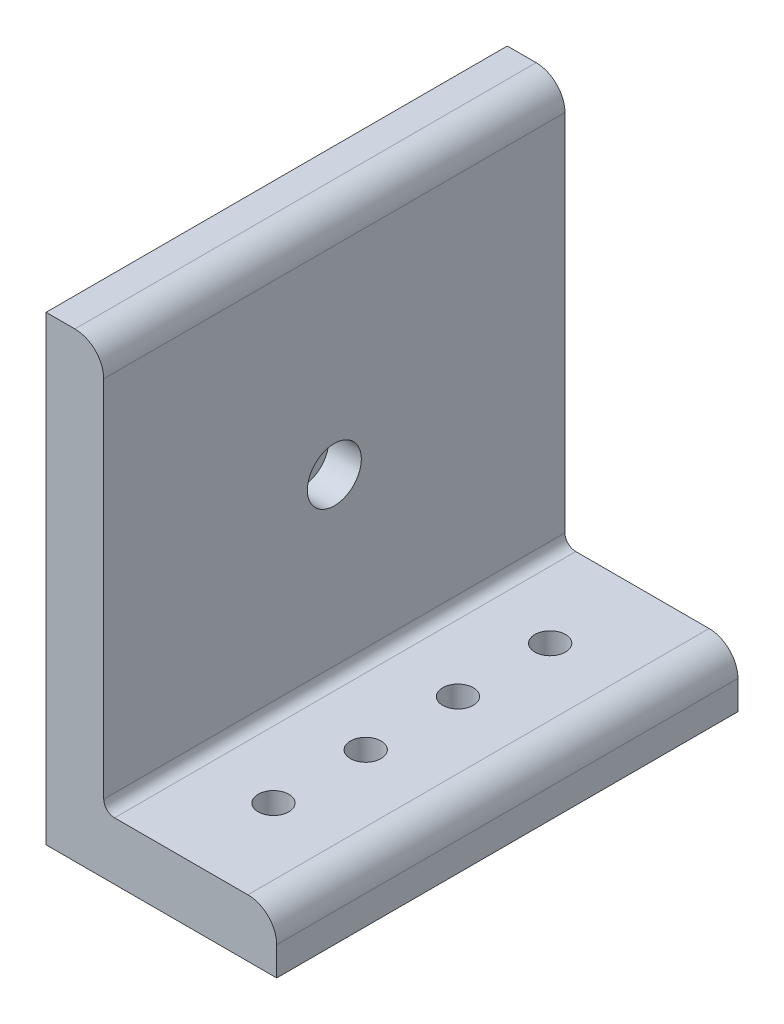
ISO-10303-21;
HEADER;
FILE_DESCRIPTION(('STEP AP214'),'2;1');
FILE_NAME('part.step','',(''),(''),'','','');
FILE_SCHEMA(('AUTOMOTIVE_DESIGN { 1 0 10303 214 1 1 1 1 }'));
ENDSEC;
DATA;
#1=APPLICATION_CONTEXT('core data for automotive mechanical design processes');
#2=APPLICATION_PROTOCOL_DEFINITION('international standard','automotive_design',2000,#1);
#3=PRODUCT_CONTEXT('',#1,'mechanical');
#4=PRODUCT('Part','Part','',(#3));
#5=PRODUCT_RELATED_PRODUCT_CATEGORY('part','',(#4));
#6=PRODUCT_DEFINITION_FORMATION('','',#4);
#7=PRODUCT_DEFINITION_CONTEXT('part definition',#1,'design');
#8=PRODUCT_DEFINITION('design','',#6,#7);
#9=PRODUCT_DEFINITION_SHAPE('','',#8);
#10=(LENGTH_UNIT() NAMED_UNIT(*) SI_UNIT(.MILLI.,.METRE.));
#11=(NAMED_UNIT(*) PLANE_ANGLE_UNIT() SI_UNIT($,.RADIAN.));
#12=(NAMED_UNIT(*) SI_UNIT($,.STERADIAN.) SOLID_ANGLE_UNIT());
#13=UNCERTAINTY_MEASURE_WITH_UNIT(LENGTH_MEASURE(1.E-05),#10,'distance_accuracy_value','');
#14=(GEOMETRIC_REPRESENTATION_CONTEXT(3) GLOBAL_UNCERTAINTY_ASSIGNED_CONTEXT((#13)) GLOBAL_UNIT_ASSIGNED_CONTEXT((#10,
#11,#12)) REPRESENTATION_CONTEXT('',''));
#15=CARTESIAN_POINT('',(0.,0.,0.));
#16=DIRECTION('',(0.,0.,1.));
#17=DIRECTION('',(1.,0.,0.));
#18=AXIS2_PLACEMENT_3D('',#15,#16,#17);
#19=CARTESIAN_POINT('',(421.099925431454,-195.774980879017,69.5361036958903));
#20=DIRECTION('',(0.,-1.,0.));
#21=DIRECTION('',(0.,0.,-1.));
#22=AXIS2_PLACEMENT_3D('',#19,#20,#21);
#23=PLANE('',#22);
#24=CARTESIAN_POINT('',(450.471215431454,-195.774980879017,-93.0238963041097));
#25=DIRECTION('',(0.,1.,0.));
#26=DIRECTION('',(0.,0.,1.));
#27=AXIS2_PLACEMENT_3D('',#24,#25,#26);
#28=CIRCLE('',#27,6.74624000000001);
#29=CARTESIAN_POINT('',(450.471215431454,-195.774980879017,-86.2776563041097));
#30=VERTEX_POINT('',#29);
#31=EDGE_CURVE('E256',#30,#30,#28,.T.);
#32=ORIENTED_EDGE('',*,*,#31,.F.);
#33=EDGE_LOOP('',(#32));
#34=FACE_BOUND('',#33,.T.);
#35=CARTESIAN_POINT('',(450.471215431454,-195.774980879017,-52.3838963041097));
#36=DIRECTION('',(0.,1.,0.));
#37=DIRECTION('',(0.,0.,1.));
#38=AXIS2_PLACEMENT_3D('',#35,#36,#37);
#39=CIRCLE('',#38,6.74624000000001);
#40=CARTESIAN_POINT('',(450.471215431454,-195.774980879017,-45.6376563041097));
#41=VERTEX_POINT('',#40);
#42=EDGE_CURVE('E250',#41,#41,#39,.T.);
#43=ORIENTED_EDGE('',*,*,#42,.F.);
#44=EDGE_LOOP('',(#43));
#45=FACE_BOUND('',#44,.T.);
#46=CARTESIAN_POINT('',(450.471215431454,-195.774980879017,-11.7438963041097));
#47=DIRECTION('',(0.,1.,0.));
#48=DIRECTION('',(0.,0.,1.));
#49=AXIS2_PLACEMENT_3D('',#46,#47,#48);
#50=CIRCLE('',#49,6.74624000000001);
#51=CARTESIAN_POINT('',(450.471215431454,-195.774980879017,-4.9976563041097));
#52=VERTEX_POINT('',#51);
#53=EDGE_CURVE('E244',#52,#52,#50,.T.);
#54=ORIENTED_EDGE('',*,*,#53,.F.);
#55=EDGE_LOOP('',(#54));
#56=FACE_BOUND('',#55,.T.);
#57=DIRECTION('',(-1.,0.,0.));
#58=VECTOR('',#57,1.);
#59=CARTESIAN_POINT('',(421.099925431454,-195.774980879017,-133.66389630411));
#60=LINE('',#59,#58);
#61=CARTESIAN_POINT('',(479.842505431454,-195.774980879017,-133.66389630411));
#62=VERTEX_POINT('',#61);
#63=CARTESIAN_POINT('',(421.099925431454,-195.774980879017,-133.66389630411));
#64=VERTEX_POINT('',#63);
#65=EDGE_CURVE('E186',#62,#64,#60,.T.);
#66=ORIENTED_EDGE('',*,*,#65,.T.);
#67=DIRECTION('',(0.,0.,-1.));
#68=VECTOR('',#67,1.);
#69=CARTESIAN_POINT('',(421.099925431454,-195.774980879017,69.5361036958903));
#70=LINE('',#69,#68);
#71=CARTESIAN_POINT('',(421.099925431454,-195.774980879017,69.5361036958903));
#72=VERTEX_POINT('',#71);
#73=EDGE_CURVE('E202',#72,#64,#70,.T.);
#74=ORIENTED_EDGE('',*,*,#73,.F.);
#75=DIRECTION('',(-1.,0.,0.));
#76=VECTOR('',#75,1.);
#77=CARTESIAN_POINT('',(421.099925431454,-195.774980879017,69.5361036958903));
#78=LINE('',#77,#76);
#79=CARTESIAN_POINT('',(479.842505431454,-195.774980879017,69.5361036958903));
#80=VERTEX_POINT('',#79);
#81=EDGE_CURVE('E229',#80,#72,#78,.T.);
#82=ORIENTED_EDGE('',*,*,#81,.F.);
#83=DIRECTION('',(0.,0.,-1.));
#84=VECTOR('',#83,1.);
#85=CARTESIAN_POINT('',(479.842505431454,-195.774980879017,69.5361036958903));
#86=LINE('',#85,#84);
#87=EDGE_CURVE('E205',#80,#62,#86,.T.);
#88=ORIENTED_EDGE('',*,*,#87,.T.);
#89=EDGE_LOOP('',(#66,#74,#82,#88));
#90=FACE_BOUND('',#89,.T.);
#91=CARTESIAN_POINT('',(450.471215431454,-195.774980879017,28.8961036958903));
#92=DIRECTION('',(0.,1.,0.));
#93=DIRECTION('',(0.,0.,1.));
#94=AXIS2_PLACEMENT_3D('',#91,#92,#93);
#95=CIRCLE('',#94,6.74624000000001);
#96=CARTESIAN_POINT('',(450.471215431454,-195.774980879017,35.6423436958903));
#97=VERTEX_POINT('',#96);
#98=EDGE_CURVE('E238',#97,#97,#95,.T.);
#99=ORIENTED_EDGE('',*,*,#98,.F.);
#100=EDGE_LOOP('',(#99));
#101=FACE_BOUND('',#100,.T.);
#102=ADVANCED_FACE('F75',(#34,#45,#56,#90,#101),#23,.F.);
#103=CARTESIAN_POINT('',(492.537425431454,-221.174980879017,69.5361036958903));
#104=DIRECTION('',(0.,1.,0.));
#105=DIRECTION('',(0.,0.,1.));
#106=AXIS2_PLACEMENT_3D('',#103,#104,#105);
#107=PLANE('',#106);
#108=CARTESIAN_POINT('',(450.471215431454,-221.174980879017,-93.0238963041097));
#109=DIRECTION('',(0.,1.,0.));
#110=DIRECTION('',(0.,0.,1.));
#111=AXIS2_PLACEMENT_3D('',#108,#109,#110);
#112=CIRCLE('',#111,6.74624000000001);
#113=CARTESIAN_POINT('',(450.471215431454,-221.174980879017,-86.2776563041097));
#114=VERTEX_POINT('',#113);
#115=EDGE_CURVE('E253',#114,#114,#112,.T.);
#116=ORIENTED_EDGE('',*,*,#115,.T.);
#117=EDGE_LOOP('',(#116));
#118=FACE_BOUND('',#117,.T.);
#119=CARTESIAN_POINT('',(450.471215431454,-221.174980879017,-52.3838963041097));
#120=DIRECTION('',(0.,1.,0.));
#121=DIRECTION('',(0.,0.,1.));
#122=AXIS2_PLACEMENT_3D('',#119,#120,#121);
#123=CIRCLE('',#122,6.74624000000001);
#124=CARTESIAN_POINT('',(450.471215431454,-221.174980879017,-45.6376563041097));
#125=VERTEX_POINT('',#124);
#126=EDGE_CURVE('E247',#125,#125,#123,.T.);
#127=ORIENTED_EDGE('',*,*,#126,.T.);
#128=EDGE_LOOP('',(#127));
#129=FACE_BOUND('',#128,.T.);
#130=CARTESIAN_POINT('',(450.471215431454,-221.174980879017,-11.7438963041097));
#131=DIRECTION('',(0.,1.,0.));
#132=DIRECTION('',(0.,0.,1.));
#133=AXIS2_PLACEMENT_3D('',#130,#131,#132);
#134=CIRCLE('',#133,6.74624000000001);
#135=CARTESIAN_POINT('',(450.471215431454,-221.174980879017,-4.9976563041097));
#136=VERTEX_POINT('',#135);
#137=EDGE_CURVE('E241',#136,#136,#134,.T.);
#138=ORIENTED_EDGE('',*,*,#137,.T.);
#139=EDGE_LOOP('',(#138));
#140=FACE_BOUND('',#139,.T.);
#141=CARTESIAN_POINT('',(450.471215431454,-221.174980879017,28.8961036958903));
#142=DIRECTION('',(0.,1.,0.));
#143=DIRECTION('',(0.,0.,1.));
#144=AXIS2_PLACEMENT_3D('',#141,#142,#143);
#145=CIRCLE('',#144,6.74624000000001);
#146=CARTESIAN_POINT('',(450.471215431454,-221.174980879017,35.6423436958903));
#147=VERTEX_POINT('',#146);
#148=EDGE_CURVE('E182',#147,#147,#145,.T.);
#149=ORIENTED_EDGE('',*,*,#148,.T.);
#150=EDGE_LOOP('',(#149));
#151=FACE_BOUND('',#150,.T.);
#152=DIRECTION('',(1.,0.,0.));
#153=VECTOR('',#152,1.);
#154=CARTESIAN_POINT('',(492.537425431454,-221.174980879017,-133.66389630411));
#155=LINE('',#154,#153);
#156=CARTESIAN_POINT('',(390.937425431454,-221.174980879017,-133.66389630411));
#157=VERTEX_POINT('',#156);
#158=CARTESIAN_POINT('',(492.537425431454,-221.174980879017,-133.66389630411));
#159=VERTEX_POINT('',#158);
#160=EDGE_CURVE('E178',#157,#159,#155,.T.);
#161=ORIENTED_EDGE('',*,*,#160,.T.);
#162=DIRECTION('',(0.,0.,-1.));
#163=VECTOR('',#162,1.);
#164=CARTESIAN_POINT('',(492.537425431454,-221.174980879017,69.5361036958903));
#165=LINE('',#164,#163);
#166=CARTESIAN_POINT('',(492.537425431454,-221.174980879017,69.5361036958903));
#167=VERTEX_POINT('',#166);
#168=EDGE_CURVE('E13',#167,#159,#165,.T.);
#169=ORIENTED_EDGE('',*,*,#168,.F.);
#170=DIRECTION('',(1.,0.,0.));
#171=VECTOR('',#170,1.);
#172=CARTESIAN_POINT('',(492.537425431454,-221.174980879017,69.5361036958903));
#173=LINE('',#172,#171);
#174=CARTESIAN_POINT('',(390.937425431454,-221.174980879017,69.5361036958903));
#175=VERTEX_POINT('',#174);
#176=EDGE_CURVE('E195',#175,#167,#173,.T.);
#177=ORIENTED_EDGE('',*,*,#176,.F.);
#178=DIRECTION('',(0.,0.,-1.));
#179=VECTOR('',#178,1.);
#180=CARTESIAN_POINT('',(390.937425431454,-221.174980879017,69.5361036958903));
#181=LINE('',#180,#179);
#182=EDGE_CURVE('E174',#175,#157,#181,.T.);
#183=ORIENTED_EDGE('',*,*,#182,.T.);
#184=EDGE_LOOP('',(#161,#169,#177,#183));
#185=FACE_BOUND('',#184,.T.);
#186=ADVANCED_FACE('F77',(#118,#129,#140,#151,#185),#107,.F.);
#187=CARTESIAN_POINT('',(492.537425431454,-208.469900879017,69.5361036958903));
#188=DIRECTION('',(-1.,0.,0.));
#189=DIRECTION('',(0.,0.,1.));
#190=AXIS2_PLACEMENT_3D('',#187,#188,#189);
#191=PLANE('',#190);
#192=DIRECTION('',(0.,1.,0.));
#193=VECTOR('',#192,1.);
#194=CARTESIAN_POINT('',(492.537425431454,-208.469900879017,-133.66389630411));
#195=LINE('',#194,#193);
#196=CARTESIAN_POINT('',(492.537425431454,-208.469900879017,-133.66389630411));
#197=VERTEX_POINT('',#196);
#198=EDGE_CURVE('E181',#159,#197,#195,.T.);
#199=ORIENTED_EDGE('',*,*,#198,.T.);
#200=DIRECTION('',(0.,0.,-1.));
#201=VECTOR('',#200,1.);
#202=CARTESIAN_POINT('',(492.537425431454,-208.469900879017,69.5361036958903));
#203=LINE('',#202,#201);
#204=CARTESIAN_POINT('',(492.537425431454,-208.469900879017,69.5361036958903));
#205=VERTEX_POINT('',#204);
#206=EDGE_CURVE('E84',#205,#197,#203,.T.);
#207=ORIENTED_EDGE('',*,*,#206,.F.);
#208=DIRECTION('',(0.,1.,0.));
#209=VECTOR('',#208,1.);
#210=CARTESIAN_POINT('',(492.537425431454,-208.469900879017,69.5361036958903));
#211=LINE('',#210,#209);
#212=EDGE_CURVE('E138',#167,#205,#211,.T.);
#213=ORIENTED_EDGE('',*,*,#212,.F.);
#214=ORIENTED_EDGE('',*,*,#168,.T.);
#215=EDGE_LOOP('',(#199,#207,#213,#214));
#216=FACE_BOUND('',#215,.T.);
#217=ADVANCED_FACE('F300',(#216),#191,.F.);
#218=CARTESIAN_POINT('',(479.842505431454,-208.469900879017,69.5361036958903));
#219=DIRECTION('',(0.,0.,-1.));
#220=DIRECTION('',(-1.,0.,0.));
#221=AXIS2_PLACEMENT_3D('',#218,#219,#220);
#222=CYLINDRICAL_SURFACE('',#221,12.69492);
#223=CARTESIAN_POINT('',(479.842505431454,-208.469900879017,-133.66389630411));
#224=DIRECTION('',(0.,0.,1.));
#225=DIRECTION('',(1.,0.,0.));
#226=AXIS2_PLACEMENT_3D('',#223,#224,#225);
#227=CIRCLE('',#226,12.69492);
#228=EDGE_CURVE('E184',#197,#62,#227,.T.);
#229=ORIENTED_EDGE('',*,*,#228,.T.);
#230=ORIENTED_EDGE('',*,*,#87,.F.);
#231=CARTESIAN_POINT('',(479.842505431454,-208.469900879017,69.5361036958903));
#232=DIRECTION('',(0.,0.,1.));
#233=DIRECTION('',(1.,0.,0.));
#234=AXIS2_PLACEMENT_3D('',#231,#232,#233);
#235=CIRCLE('',#234,12.69492);
#236=EDGE_CURVE('E213',#205,#80,#235,.T.);
#237=ORIENTED_EDGE('',*,*,#236,.F.);
#238=ORIENTED_EDGE('',*,*,#206,.T.);
#239=EDGE_LOOP('',(#229,#230,#237,#238));
#240=FACE_BOUND('',#239,.T.);
#241=ADVANCED_FACE('F211',(#240),#222,.T.);
#242=CARTESIAN_POINT('',(421.099925431454,-191.012480879017,69.5361036958903));
#243=DIRECTION('',(0.,0.,-1.));
#244=DIRECTION('',(-1.,0.,0.));
#245=AXIS2_PLACEMENT_3D('',#242,#243,#244);
#246=CYLINDRICAL_SURFACE('',#245,4.7625);
#247=CARTESIAN_POINT('',(421.099925431454,-191.012480879017,-133.66389630411));
#248=DIRECTION('',(0.,0.,-1.));
#249=DIRECTION('',(-1.,0.,0.));
#250=AXIS2_PLACEMENT_3D('',#247,#248,#249);
#251=CIRCLE('',#250,4.7625);
#252=CARTESIAN_POINT('',(416.337425431454,-191.012480879017,-133.66389630411));
#253=VERTEX_POINT('',#252);
#254=EDGE_CURVE('E188',#64,#253,#251,.T.);
#255=ORIENTED_EDGE('',*,*,#254,.T.);
#256=DIRECTION('',(0.,0.,-1.));
#257=VECTOR('',#256,1.);
#258=CARTESIAN_POINT('',(416.337425431454,-191.012480879017,69.5361036958903));
#259=LINE('',#258,#257);
#260=CARTESIAN_POINT('',(416.337425431454,-191.012480879017,69.5361036958903));
#261=VERTEX_POINT('',#260);
#262=EDGE_CURVE('E199',#261,#253,#259,.T.);
#263=ORIENTED_EDGE('',*,*,#262,.F.);
#264=CARTESIAN_POINT('',(421.099925431454,-191.012480879017,69.5361036958903));
#265=DIRECTION('',(0.,0.,-1.));
#266=DIRECTION('',(-1.,0.,0.));
#267=AXIS2_PLACEMENT_3D('',#264,#265,#266);
#268=CIRCLE('',#267,4.7625);
#269=EDGE_CURVE('E228',#72,#261,#268,.T.);
#270=ORIENTED_EDGE('',*,*,#269,.F.);
#271=ORIENTED_EDGE('',*,*,#73,.T.);
#272=EDGE_LOOP('',(#255,#263,#270,#271));
#273=FACE_BOUND('',#272,.T.);
#274=ADVANCED_FACE('F226',(#273),#246,.F.);
#275=CARTESIAN_POINT('',(416.337425431454,-30.6699008790166,69.5361036958903));
#276=DIRECTION('',(-1.,0.,0.));
#277=DIRECTION('',(0.,0.,1.));
#278=AXIS2_PLACEMENT_3D('',#275,#276,#277);
#279=PLANE('',#278);
#280=CARTESIAN_POINT('',(416.337425431454,-118.000180879017,-32.0638963041097));
#281=DIRECTION('',(1.,0.,0.));
#282=DIRECTION('',(0.,0.,-1.));
#283=AXIS2_PLACEMENT_3D('',#280,#281,#282);
#284=CIRCLE('',#283,11.89);
#285=CARTESIAN_POINT('',(416.337425431454,-118.000180879017,-43.9538963041097));
#286=VERTEX_POINT('',#285);
#287=EDGE_CURVE('E268',#286,#286,#284,.T.);
#288=ORIENTED_EDGE('',*,*,#287,.F.);
#289=EDGE_LOOP('',(#288));
#290=FACE_BOUND('',#289,.T.);
#291=DIRECTION('',(0.,1.,0.));
#292=VECTOR('',#291,1.);
#293=CARTESIAN_POINT('',(416.337425431454,-30.6699008790166,-133.66389630411));
#294=LINE('',#293,#292);
#295=CARTESIAN_POINT('',(416.337425431454,-30.6699008790166,-133.66389630411));
#296=VERTEX_POINT('',#295);
#297=EDGE_CURVE('E190',#253,#296,#294,.T.);
#298=ORIENTED_EDGE('',*,*,#297,.T.);
#299=DIRECTION('',(0.,0.,-1.));
#300=VECTOR('',#299,1.);
#301=CARTESIAN_POINT('',(416.337425431454,-30.6699008790166,69.5361036958903));
#302=LINE('',#301,#300);
#303=CARTESIAN_POINT('',(416.337425431454,-30.6699008790166,69.5361036958903));
#304=VERTEX_POINT('',#303);
#305=EDGE_CURVE('E169',#304,#296,#302,.T.);
#306=ORIENTED_EDGE('',*,*,#305,.F.);
#307=DIRECTION('',(0.,1.,0.));
#308=VECTOR('',#307,1.);
#309=CARTESIAN_POINT('',(416.337425431454,-30.6699008790166,69.5361036958903));
#310=LINE('',#309,#308);
#311=EDGE_CURVE('E160',#261,#304,#310,.T.);
#312=ORIENTED_EDGE('',*,*,#311,.F.);
#313=ORIENTED_EDGE('',*,*,#262,.T.);
#314=EDGE_LOOP('',(#298,#306,#312,#313));
#315=FACE_BOUND('',#314,.T.);
#316=ADVANCED_FACE('F274',(#290,#315),#279,.F.);
#317=CARTESIAN_POINT('',(403.642505431454,-30.6699008790166,69.5361036958903));
#318=DIRECTION('',(0.,0.,-1.));
#319=DIRECTION('',(-1.,0.,0.));
#320=AXIS2_PLACEMENT_3D('',#317,#318,#319);
#321=CYLINDRICAL_SURFACE('',#320,12.69492);
#322=CARTESIAN_POINT('',(403.642505431454,-30.6699008790166,-133.66389630411));
#323=DIRECTION('',(0.,0.,1.));
#324=DIRECTION('',(-1.,0.,0.));
#325=AXIS2_PLACEMENT_3D('',#322,#323,#324);
#326=CIRCLE('',#325,12.69492);
#327=CARTESIAN_POINT('',(403.642505431454,-17.9749808790166,-133.66389630411));
#328=VERTEX_POINT('',#327);
#329=EDGE_CURVE('E168',#296,#328,#326,.T.);
#330=ORIENTED_EDGE('',*,*,#329,.T.);
#331=DIRECTION('',(0.,0.,-1.));
#332=VECTOR('',#331,1.);
#333=CARTESIAN_POINT('',(403.642505431454,-17.9749808790166,69.5361036958903));
#334=LINE('',#333,#332);
#335=CARTESIAN_POINT('',(403.642505431454,-17.9749808790166,69.5361036958903));
#336=VERTEX_POINT('',#335);
#337=EDGE_CURVE('E165',#336,#328,#334,.T.);
#338=ORIENTED_EDGE('',*,*,#337,.F.);
#339=CARTESIAN_POINT('',(403.642505431454,-30.6699008790166,69.5361036958903));
#340=DIRECTION('',(0.,0.,1.));
#341=DIRECTION('',(-1.,0.,0.));
#342=AXIS2_PLACEMENT_3D('',#339,#340,#341);
#343=CIRCLE('',#342,12.69492);
#344=EDGE_CURVE('E154',#304,#336,#343,.T.);
#345=ORIENTED_EDGE('',*,*,#344,.F.);
#346=ORIENTED_EDGE('',*,*,#305,.T.);
#347=EDGE_LOOP('',(#330,#338,#345,#346));
#348=FACE_BOUND('',#347,.T.);
#349=ADVANCED_FACE('F166',(#348),#321,.T.);
#350=CARTESIAN_POINT('',(390.937425431454,-17.9749808790166,69.5361036958903));
#351=DIRECTION('',(0.,-1.,0.));
#352=DIRECTION('',(0.,0.,-1.));
#353=AXIS2_PLACEMENT_3D('',#350,#351,#352);
#354=PLANE('',#353);
#355=DIRECTION('',(-1.,0.,0.));
#356=VECTOR('',#355,1.);
#357=CARTESIAN_POINT('',(390.937425431454,-17.9749808790166,-133.66389630411));
#358=LINE('',#357,#356);
#359=CARTESIAN_POINT('',(390.937425431454,-17.9749808790166,-133.66389630411));
#360=VERTEX_POINT('',#359);
#361=EDGE_CURVE('E124',#328,#360,#358,.T.);
#362=ORIENTED_EDGE('',*,*,#361,.T.);
#363=DIRECTION('',(0.,0.,-1.));
#364=VECTOR('',#363,1.);
#365=CARTESIAN_POINT('',(390.937425431454,-17.9749808790166,69.5361036958903));
#366=LINE('',#365,#364);
#367=CARTESIAN_POINT('',(390.937425431454,-17.9749808790166,69.5361036958903));
#368=VERTEX_POINT('',#367);
#369=EDGE_CURVE('E170',#368,#360,#366,.T.);
#370=ORIENTED_EDGE('',*,*,#369,.F.);
#371=DIRECTION('',(-1.,0.,0.));
#372=VECTOR('',#371,1.);
#373=CARTESIAN_POINT('',(390.937425431454,-17.9749808790166,69.5361036958903));
#374=LINE('',#373,#372);
#375=EDGE_CURVE('E158',#336,#368,#374,.T.);
#376=ORIENTED_EDGE('',*,*,#375,.F.);
#377=ORIENTED_EDGE('',*,*,#337,.T.);
#378=EDGE_LOOP('',(#362,#370,#376,#377));
#379=FACE_BOUND('',#378,.T.);
#380=ADVANCED_FACE('F172',(#379),#354,.F.);
#381=CARTESIAN_POINT('',(390.937425431454,-221.174980879017,69.5361036958903));
#382=DIRECTION('',(1.,0.,0.));
#383=DIRECTION('',(0.,1.,0.));
#384=AXIS2_PLACEMENT_3D('',#381,#382,#383);
#385=PLANE('',#384);
#386=CARTESIAN_POINT('',(390.937425431454,-118.000180879017,-32.0638963041097));
#387=DIRECTION('',(1.,0.,0.));
#388=DIRECTION('',(0.,0.,-1.));
#389=AXIS2_PLACEMENT_3D('',#386,#387,#388);
#390=CIRCLE('',#389,6.74999999999999);
#391=CARTESIAN_POINT('',(390.937425431454,-118.000180879017,-38.8138963041097));
#392=VERTEX_POINT('',#391);
#393=EDGE_CURVE('E259',#392,#392,#390,.T.);
#394=ORIENTED_EDGE('',*,*,#393,.T.);
#395=EDGE_LOOP('',(#394));
#396=FACE_BOUND('',#395,.T.);
#397=DIRECTION('',(0.,-1.,0.));
#398=VECTOR('',#397,1.);
#399=CARTESIAN_POINT('',(390.937425431454,-221.174980879017,-133.66389630411));
#400=LINE('',#399,#398);
#401=EDGE_CURVE('E130',#360,#157,#400,.T.);
#402=ORIENTED_EDGE('',*,*,#401,.T.);
#403=ORIENTED_EDGE('',*,*,#182,.F.);
#404=DIRECTION('',(0.,-1.,0.));
#405=VECTOR('',#404,1.);
#406=CARTESIAN_POINT('',(390.937425431454,-221.174980879017,69.5361036958903));
#407=LINE('',#406,#405);
#408=EDGE_CURVE('E92',#368,#175,#407,.T.);
#409=ORIENTED_EDGE('',*,*,#408,.F.);
#410=ORIENTED_EDGE('',*,*,#369,.T.);
#411=EDGE_LOOP('',(#402,#403,#409,#410));
#412=FACE_BOUND('',#411,.T.);
#413=ADVANCED_FACE('F281',(#396,#412),#385,.F.);
#414=CARTESIAN_POINT('',(403.642505431454,-30.6699008790166,69.5361036958903));
#415=DIRECTION('',(0.,0.,-1.));
#416=DIRECTION('',(-1.,0.,0.));
#417=AXIS2_PLACEMENT_3D('',#414,#415,#416);
#418=PLANE('',#417);
#419=ORIENTED_EDGE('',*,*,#176,.T.);
#420=ORIENTED_EDGE('',*,*,#212,.T.);
#421=ORIENTED_EDGE('',*,*,#236,.T.);
#422=ORIENTED_EDGE('',*,*,#81,.T.);
#423=ORIENTED_EDGE('',*,*,#269,.T.);
#424=ORIENTED_EDGE('',*,*,#311,.T.);
#425=ORIENTED_EDGE('',*,*,#344,.T.);
#426=ORIENTED_EDGE('',*,*,#375,.T.);
#427=ORIENTED_EDGE('',*,*,#408,.T.);
#428=EDGE_LOOP('',(#419,#420,#421,#422,#423,#424,#425,#426,#427));
#429=FACE_BOUND('',#428,.T.);
#430=ADVANCED_FACE('F156',(#429),#418,.F.);
#431=CARTESIAN_POINT('',(403.642505431454,-30.6699008790166,-133.66389630411));
#432=DIRECTION('',(0.,0.,-1.));
#433=DIRECTION('',(-1.,0.,0.));
#434=AXIS2_PLACEMENT_3D('',#431,#432,#433);
#435=PLANE('',#434);
#436=ORIENTED_EDGE('',*,*,#160,.F.);
#437=ORIENTED_EDGE('',*,*,#401,.F.);
#438=ORIENTED_EDGE('',*,*,#361,.F.);
#439=ORIENTED_EDGE('',*,*,#329,.F.);
#440=ORIENTED_EDGE('',*,*,#297,.F.);
#441=ORIENTED_EDGE('',*,*,#254,.F.);
#442=ORIENTED_EDGE('',*,*,#65,.F.);
#443=ORIENTED_EDGE('',*,*,#228,.F.);
#444=ORIENTED_EDGE('',*,*,#198,.F.);
#445=EDGE_LOOP('',(#436,#437,#438,#439,#440,#441,#442,#443,#444));
#446=FACE_BOUND('',#445,.T.);
#447=ADVANCED_FACE('F217',(#446),#435,.T.);
#448=CARTESIAN_POINT('',(450.471215431454,-195.774980879017,28.8961036958903));
#449=DIRECTION('',(0.,1.,0.));
#450=DIRECTION('',(0.,0.,1.));
#451=AXIS2_PLACEMENT_3D('',#448,#449,#450);
#452=CYLINDRICAL_SURFACE('',#451,6.74624000000001);
#453=ORIENTED_EDGE('',*,*,#148,.F.);
#454=EDGE_LOOP('',(#453));
#455=FACE_BOUND('',#454,.T.);
#456=ORIENTED_EDGE('',*,*,#98,.T.);
#457=EDGE_LOOP('',(#456));
#458=FACE_BOUND('',#457,.T.);
#459=ADVANCED_FACE('F345',(#455,#458),#452,.F.);
#460=CARTESIAN_POINT('',(450.471215431454,-195.774980879017,-11.7438963041097));
#461=DIRECTION('',(0.,1.,0.));
#462=DIRECTION('',(0.,0.,1.));
#463=AXIS2_PLACEMENT_3D('',#460,#461,#462);
#464=CYLINDRICAL_SURFACE('',#463,6.74624000000001);
#465=ORIENTED_EDGE('',*,*,#137,.F.);
#466=EDGE_LOOP('',(#465));
#467=FACE_BOUND('',#466,.T.);
#468=ORIENTED_EDGE('',*,*,#53,.T.);
#469=EDGE_LOOP('',(#468));
#470=FACE_BOUND('',#469,.T.);
#471=ADVANCED_FACE('F362',(#467,#470),#464,.F.);
#472=CARTESIAN_POINT('',(450.471215431454,-195.774980879017,-52.3838963041097));
#473=DIRECTION('',(0.,1.,0.));
#474=DIRECTION('',(0.,0.,1.));
#475=AXIS2_PLACEMENT_3D('',#472,#473,#474);
#476=CYLINDRICAL_SURFACE('',#475,6.74624000000001);
#477=ORIENTED_EDGE('',*,*,#126,.F.);
#478=EDGE_LOOP('',(#477));
#479=FACE_BOUND('',#478,.T.);
#480=ORIENTED_EDGE('',*,*,#42,.T.);
#481=EDGE_LOOP('',(#480));
#482=FACE_BOUND('',#481,.T.);
#483=ADVANCED_FACE('F372',(#479,#482),#476,.F.);
#484=CARTESIAN_POINT('',(450.471215431454,-195.774980879017,-93.0238963041097));
#485=DIRECTION('',(0.,1.,0.));
#486=DIRECTION('',(0.,0.,1.));
#487=AXIS2_PLACEMENT_3D('',#484,#485,#486);
#488=CYLINDRICAL_SURFACE('',#487,6.74624000000001);
#489=ORIENTED_EDGE('',*,*,#115,.F.);
#490=EDGE_LOOP('',(#489));
#491=FACE_BOUND('',#490,.T.);
#492=ORIENTED_EDGE('',*,*,#31,.T.);
#493=EDGE_LOOP('',(#492));
#494=FACE_BOUND('',#493,.T.);
#495=ADVANCED_FACE('F382',(#491,#494),#488,.F.);
#496=CARTESIAN_POINT('',(416.337425431454,-118.000180879017,-32.0638963041097));
#497=DIRECTION('',(1.,0.,0.));
#498=DIRECTION('',(0.,0.,-1.));
#499=AXIS2_PLACEMENT_3D('',#496,#497,#498);
#500=CYLINDRICAL_SURFACE('',#499,6.74999999999999);
#501=ORIENTED_EDGE('',*,*,#393,.F.);
#502=EDGE_LOOP('',(#501));
#503=FACE_BOUND('',#502,.T.);
#504=CARTESIAN_POINT('',(402.037425431454,-118.000180879017,-32.0638963041097));
#505=DIRECTION('',(1.,0.,0.));
#506=DIRECTION('',(0.,0.,-1.));
#507=AXIS2_PLACEMENT_3D('',#504,#505,#506);
#508=CIRCLE('',#507,6.74999999999999);
#509=CARTESIAN_POINT('',(402.037425431454,-118.000180879017,-38.8138963041097));
#510=VERTEX_POINT('',#509);
#511=EDGE_CURVE('E262',#510,#510,#508,.T.);
#512=ORIENTED_EDGE('',*,*,#511,.T.);
#513=EDGE_LOOP('',(#512));
#514=FACE_BOUND('',#513,.T.);
#515=ADVANCED_FACE('F392',(#503,#514),#500,.F.);
#516=CARTESIAN_POINT('',(402.037425431454,-111.250180879017,-32.0638963041097));
#517=DIRECTION('',(-1.,0.,0.));
#518=DIRECTION('',(0.,0.,1.));
#519=AXIS2_PLACEMENT_3D('',#516,#517,#518);
#520=PLANE('',#519);
#521=ORIENTED_EDGE('',*,*,#511,.F.);
#522=EDGE_LOOP('',(#521));
#523=FACE_BOUND('',#522,.T.);
#524=CARTESIAN_POINT('',(402.037425431454,-118.000180879017,-32.0638963041097));
#525=DIRECTION('',(1.,0.,0.));
#526=DIRECTION('',(0.,0.,-1.));
#527=AXIS2_PLACEMENT_3D('',#524,#525,#526);
#528=CIRCLE('',#527,11.89);
#529=CARTESIAN_POINT('',(402.037425431454,-118.000180879017,-43.9538963041097));
#530=VERTEX_POINT('',#529);
#531=EDGE_CURVE('E265',#530,#530,#528,.T.);
#532=ORIENTED_EDGE('',*,*,#531,.T.);
#533=EDGE_LOOP('',(#532));
#534=FACE_BOUND('',#533,.T.);
#535=ADVANCED_FACE('F401',(#523,#534),#520,.F.);
#536=CARTESIAN_POINT('',(416.337425431454,-118.000180879017,-32.0638963041097));
#537=DIRECTION('',(1.,0.,0.));
#538=DIRECTION('',(0.,0.,-1.));
#539=AXIS2_PLACEMENT_3D('',#536,#537,#538);
#540=CYLINDRICAL_SURFACE('',#539,11.89);
#541=ORIENTED_EDGE('',*,*,#531,.F.);
#542=EDGE_LOOP('',(#541));
#543=FACE_BOUND('',#542,.T.);
#544=ORIENTED_EDGE('',*,*,#287,.T.);
#545=EDGE_LOOP('',(#544));
#546=FACE_BOUND('',#545,.T.);
#547=ADVANCED_FACE('F272',(#543,#546),#540,.F.);
#548=CLOSED_SHELL('',(#102,#186,#217,#241,#274,#316,#349,#380,#413,#430,#447,#459,#471,#483,
#495,#515,#535,#547));
#549=MANIFOLD_SOLID_BREP('B2',#548);
#550=ADVANCED_BREP_SHAPE_REPRESENTATION('',(#18,#549),#14);
#551=SHAPE_DEFINITION_REPRESENTATION(#9,#550);
ENDSEC;
END-ISO-10303-21;
